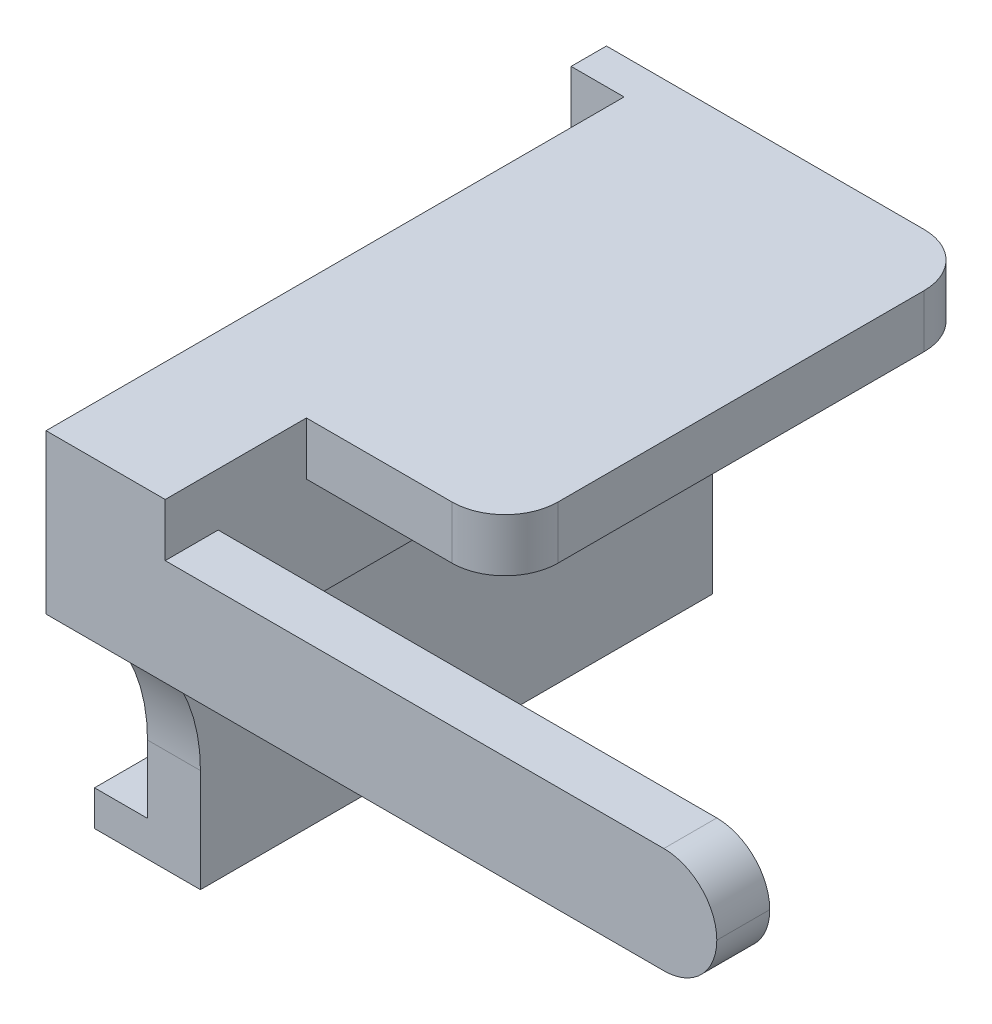
ISO-10303-21;
HEADER;
FILE_DESCRIPTION(('STEP AP214'),'2;1');
FILE_NAME('part.step','',(''),(''),'','','');
FILE_SCHEMA(('AUTOMOTIVE_DESIGN { 1 0 10303 214 1 1 1 1 }'));
ENDSEC;
DATA;
#1=APPLICATION_CONTEXT('core data for automotive mechanical design processes');
#2=APPLICATION_PROTOCOL_DEFINITION('international standard','automotive_design',2000,#1);
#3=PRODUCT_CONTEXT('',#1,'mechanical');
#4=PRODUCT('Part','Part','',(#3));
#5=PRODUCT_RELATED_PRODUCT_CATEGORY('part','',(#4));
#6=PRODUCT_DEFINITION_FORMATION('','',#4);
#7=PRODUCT_DEFINITION_CONTEXT('part definition',#1,'design');
#8=PRODUCT_DEFINITION('design','',#6,#7);
#9=PRODUCT_DEFINITION_SHAPE('','',#8);
#10=(LENGTH_UNIT() NAMED_UNIT(*) SI_UNIT(.MILLI.,.METRE.));
#11=(NAMED_UNIT(*) PLANE_ANGLE_UNIT() SI_UNIT($,.RADIAN.));
#12=(NAMED_UNIT(*) SI_UNIT($,.STERADIAN.) SOLID_ANGLE_UNIT());
#13=UNCERTAINTY_MEASURE_WITH_UNIT(LENGTH_MEASURE(1.E-05),#10,'distance_accuracy_value','');
#14=(GEOMETRIC_REPRESENTATION_CONTEXT(3) GLOBAL_UNCERTAINTY_ASSIGNED_CONTEXT((#13)) GLOBAL_UNIT_ASSIGNED_CONTEXT((#10,
#11,#12)) REPRESENTATION_CONTEXT('',''));
#15=CARTESIAN_POINT('',(0.,0.,0.));
#16=DIRECTION('',(0.,0.,1.));
#17=DIRECTION('',(1.,0.,0.));
#18=AXIS2_PLACEMENT_3D('',#15,#16,#17);
#19=CARTESIAN_POINT('',(0.,0.394799999999999,0.));
#20=DIRECTION('',(0.,-1.,0.));
#21=DIRECTION('',(0.,0.,-1.));
#22=AXIS2_PLACEMENT_3D('',#19,#20,#21);
#23=PLANE('',#22);
#24=DIRECTION('',(-1.,0.,0.));
#25=VECTOR('',#24,1.);
#26=CARTESIAN_POINT('',(0.,0.394799999999999,1.6020714590804));
#27=LINE('',#26,#25);
#28=CARTESIAN_POINT('',(6.75000001549883,0.394799999999999,1.6020714590804));
#29=VERTEX_POINT('',#28);
#30=CARTESIAN_POINT('',(3.,0.394799999999999,1.6020714590804));
#31=VERTEX_POINT('',#30);
#32=EDGE_CURVE('E13',#29,#31,#27,.T.);
#33=ORIENTED_EDGE('',*,*,#32,.F.);
#34=DIRECTION('',(0.,0.,-1.));
#35=VECTOR('',#34,1.);
#36=CARTESIAN_POINT('',(6.75000001549883,0.394800000000001,18.2210435524013));
#37=LINE('',#36,#35);
#38=CARTESIAN_POINT('',(6.75000001549883,0.394799999999996,17.2468532));
#39=VERTEX_POINT('',#38);
#40=EDGE_CURVE('E207',#39,#29,#37,.T.);
#41=ORIENTED_EDGE('',*,*,#40,.F.);
#42=DIRECTION('',(-1.,0.,0.));
#43=VECTOR('',#42,1.);
#44=CARTESIAN_POINT('',(6.75000001549883,0.394799999999996,17.2468532));
#45=LINE('',#44,#43);
#46=CARTESIAN_POINT('',(35.,0.394799999999996,17.2468532));
#47=VERTEX_POINT('',#46);
#48=EDGE_CURVE('E222',#47,#39,#45,.T.);
#49=ORIENTED_EDGE('',*,*,#48,.F.);
#50=DIRECTION('',(0.,0.,-1.));
#51=VECTOR('',#50,1.);
#52=CARTESIAN_POINT('',(35.,0.394799999999999,0.));
#53=LINE('',#52,#51);
#54=CARTESIAN_POINT('',(35.,0.394799999999996,20.2468532));
#55=VERTEX_POINT('',#54);
#56=EDGE_CURVE('E199',#47,#55,#53,.F.);
#57=ORIENTED_EDGE('',*,*,#56,.T.);
#58=DIRECTION('',(-1.,0.,0.));
#59=VECTOR('',#58,1.);
#60=CARTESIAN_POINT('',(6.75000001549883,0.394799999999996,20.2468532));
#61=LINE('',#60,#59);
#62=CARTESIAN_POINT('',(3.,0.394799999999996,20.2468532));
#63=VERTEX_POINT('',#62);
#64=EDGE_CURVE('E214',#55,#63,#61,.T.);
#65=ORIENTED_EDGE('',*,*,#64,.T.);
#66=DIRECTION('',(0.,0.,1.));
#67=VECTOR('',#66,1.);
#68=CARTESIAN_POINT('',(3.,0.394800000000001,18.2210435524013));
#69=LINE('',#68,#67);
#70=EDGE_CURVE('E216',#31,#63,#69,.T.);
#71=ORIENTED_EDGE('',*,*,#70,.F.);
#72=EDGE_LOOP('',(#33,#41,#49,#57,#65,#71));
#73=FACE_BOUND('',#72,.T.);
#74=ADVANCED_FACE('F42',(#73),#23,.T.);
#75=CARTESIAN_POINT('',(3.,0.,0.));
#76=DIRECTION('',(-1.,0.,0.));
#77=DIRECTION('',(0.,0.,1.));
#78=AXIS2_PLACEMENT_3D('',#75,#76,#77);
#79=PLANE('',#78);
#80=CARTESIAN_POINT('',(3.,0.394800000000001,-14.5));
#81=VERTEX_POINT('',#80);
#82=CARTESIAN_POINT('',(3.,0.394799999999998,-1.6020714590804));
#83=VERTEX_POINT('',#82);
#84=EDGE_CURVE('E224',#81,#83,#69,.T.);
#85=ORIENTED_EDGE('',*,*,#84,.T.);
#86=CARTESIAN_POINT('',(3.,0.,0.));
#87=DIRECTION('',(-1.,0.,0.));
#88=DIRECTION('',(0.,0.,1.));
#89=AXIS2_PLACEMENT_3D('',#86,#87,#88);
#90=CIRCLE('',#89,1.65);
#91=EDGE_CURVE('E56',#83,#31,#90,.T.);
#92=ORIENTED_EDGE('',*,*,#91,.T.);
#93=ORIENTED_EDGE('',*,*,#70,.T.);
#94=CARTESIAN_POINT('',(3.,-8.6556553641046,24.5));
#95=DIRECTION('',(-1.,0.,0.));
#96=DIRECTION('',(0.,0.,1.));
#97=AXIS2_PLACEMENT_3D('',#94,#95,#96);
#98=CIRCLE('',#97,10.);
#99=CARTESIAN_POINT('',(3.,-8.65565536410459,14.5));
#100=VERTEX_POINT('',#99);
#101=EDGE_CURVE('E292',#63,#100,#98,.T.);
#102=ORIENTED_EDGE('',*,*,#101,.T.);
#103=DIRECTION('',(0.,1.,0.));
#104=VECTOR('',#103,1.);
#105=CARTESIAN_POINT('',(3.,0.394799999999996,14.5));
#106=LINE('',#105,#104);
#107=CARTESIAN_POINT('',(3.,-14.5,14.5));
#108=VERTEX_POINT('',#107);
#109=EDGE_CURVE('E352',#108,#100,#106,.T.);
#110=ORIENTED_EDGE('',*,*,#109,.F.);
#111=DIRECTION('',(0.,0.,-1.));
#112=VECTOR('',#111,1.);
#113=CARTESIAN_POINT('',(3.,-14.5,14.5));
#114=LINE('',#113,#112);
#115=CARTESIAN_POINT('',(3.,-14.5,-14.5));
#116=VERTEX_POINT('',#115);
#117=EDGE_CURVE('E244',#108,#116,#114,.T.);
#118=ORIENTED_EDGE('',*,*,#117,.T.);
#119=DIRECTION('',(0.,1.,0.));
#120=VECTOR('',#119,1.);
#121=CARTESIAN_POINT('',(3.,-7.5,-14.5));
#122=LINE('',#121,#120);
#123=EDGE_CURVE('E246',#116,#81,#122,.T.);
#124=ORIENTED_EDGE('',*,*,#123,.T.);
#125=EDGE_LOOP('',(#85,#92,#93,#102,#110,#118,#124));
#126=FACE_BOUND('',#125,.T.);
#127=ADVANCED_FACE('F376',(#126),#79,.F.);
#128=CARTESIAN_POINT('',(0.,0.,0.));
#129=DIRECTION('',(-1.,0.,0.));
#130=DIRECTION('',(0.,0.,1.));
#131=AXIS2_PLACEMENT_3D('',#128,#129,#130);
#132=PLANE('',#131);
#133=CARTESIAN_POINT('',(0.,0.,0.));
#134=DIRECTION('',(-1.,0.,0.));
#135=DIRECTION('',(0.,0.,1.));
#136=AXIS2_PLACEMENT_3D('',#133,#134,#135);
#137=CIRCLE('',#136,1.65);
#138=CARTESIAN_POINT('',(0.,0.,1.65));
#139=VERTEX_POINT('',#138);
#140=EDGE_CURVE('E208',#139,#139,#137,.T.);
#141=ORIENTED_EDGE('',*,*,#140,.F.);
#142=EDGE_LOOP('',(#141));
#143=FACE_BOUND('',#142,.T.);
#144=DIRECTION('',(0.,-1.,0.));
#145=VECTOR('',#144,1.);
#146=CARTESIAN_POINT('',(0.,0.,14.5));
#147=LINE('',#146,#145);
#148=CARTESIAN_POINT('',(0.,-8.6556553641046,14.5));
#149=VERTEX_POINT('',#148);
#150=CARTESIAN_POINT('',(0.,-12.5,14.5));
#151=VERTEX_POINT('',#150);
#152=EDGE_CURVE('E355',#149,#151,#147,.T.);
#153=ORIENTED_EDGE('',*,*,#152,.F.);
#154=CARTESIAN_POINT('',(0.,-8.6556553641046,24.5));
#155=DIRECTION('',(-1.,0.,0.));
#156=DIRECTION('',(0.,0.,1.));
#157=AXIS2_PLACEMENT_3D('',#154,#155,#156);
#158=CIRCLE('',#157,10.);
#159=CARTESIAN_POINT('',(0.,0.394799999999996,20.2468532));
#160=VERTEX_POINT('',#159);
#161=EDGE_CURVE('E294',#149,#160,#158,.F.);
#162=ORIENTED_EDGE('',*,*,#161,.T.);
#163=DIRECTION('',(0.,-1.,0.));
#164=VECTOR('',#163,1.);
#165=CARTESIAN_POINT('',(0.,6.3948,20.2468532));
#166=LINE('',#165,#164);
#167=CARTESIAN_POINT('',(0.,9.3948,20.2468532));
#168=VERTEX_POINT('',#167);
#169=EDGE_CURVE('E359',#168,#160,#166,.T.);
#170=ORIENTED_EDGE('',*,*,#169,.F.);
#171=DIRECTION('',(0.,0.,1.));
#172=VECTOR('',#171,1.);
#173=CARTESIAN_POINT('',(0.,9.39479999999999,-12.5));
#174=LINE('',#173,#172);
#175=CARTESIAN_POINT('',(0.,9.39479999999999,-12.5));
#176=VERTEX_POINT('',#175);
#177=EDGE_CURVE('E228',#176,#168,#174,.T.);
#178=ORIENTED_EDGE('',*,*,#177,.F.);
#179=DIRECTION('',(0.,-1.,0.));
#180=VECTOR('',#179,1.);
#181=CARTESIAN_POINT('',(0.,12.5,-12.5));
#182=LINE('',#181,#180);
#183=CARTESIAN_POINT('',(0.,-11.5,-12.5));
#184=VERTEX_POINT('',#183);
#185=EDGE_CURVE('E275',#176,#184,#182,.T.);
#186=ORIENTED_EDGE('',*,*,#185,.T.);
#187=CARTESIAN_POINT('',(0.,-12.5,-12.5));
#188=DIRECTION('',(-1.,0.,0.));
#189=DIRECTION('',(0.,0.,1.));
#190=AXIS2_PLACEMENT_3D('',#187,#188,#189);
#191=CIRCLE('',#190,0.999999999999999);
#192=CARTESIAN_POINT('',(0.,-12.5,-11.5));
#193=VERTEX_POINT('',#192);
#194=EDGE_CURVE('E265',#193,#184,#191,.F.);
#195=ORIENTED_EDGE('',*,*,#194,.F.);
#196=DIRECTION('',(0.,0.,1.));
#197=VECTOR('',#196,1.);
#198=CARTESIAN_POINT('',(0.,-12.5,12.5));
#199=LINE('',#198,#197);
#200=EDGE_CURVE('E277',#193,#151,#199,.T.);
#201=ORIENTED_EDGE('',*,*,#200,.T.);
#202=EDGE_LOOP('',(#153,#162,#170,#178,#186,#195,#201));
#203=FACE_BOUND('',#202,.T.);
#204=ADVANCED_FACE('F390',(#143,#203),#132,.T.);
#205=CARTESIAN_POINT('',(6.75000001549883,0.,0.));
#206=DIRECTION('',(1.,0.,0.));
#207=DIRECTION('',(0.,0.,-1.));
#208=AXIS2_PLACEMENT_3D('',#205,#206,#207);
#209=PLANE('',#208);
#210=CARTESIAN_POINT('',(6.75000001549883,0.,0.));
#211=DIRECTION('',(1.,0.,0.));
#212=DIRECTION('',(0.,0.,-1.));
#213=AXIS2_PLACEMENT_3D('',#210,#211,#212);
#214=CIRCLE('',#213,1.65);
#215=CARTESIAN_POINT('',(6.75000001549883,0.394799999999999,-1.6020714590804));
#216=VERTEX_POINT('',#215);
#217=EDGE_CURVE('E193',#216,#29,#214,.T.);
#218=ORIENTED_EDGE('',*,*,#217,.F.);
#219=CARTESIAN_POINT('',(6.75000001549883,0.394799999999996,-14.5));
#220=VERTEX_POINT('',#219);
#221=EDGE_CURVE('E203',#216,#220,#37,.T.);
#222=ORIENTED_EDGE('',*,*,#221,.T.);
#223=DIRECTION('',(0.,1.,0.));
#224=VECTOR('',#223,1.);
#225=CARTESIAN_POINT('',(6.75000001549883,-7.5,-14.5));
#226=LINE('',#225,#224);
#227=CARTESIAN_POINT('',(6.75000001549883,6.3948,-14.5));
#228=VERTEX_POINT('',#227);
#229=EDGE_CURVE('E231',#220,#228,#226,.T.);
#230=ORIENTED_EDGE('',*,*,#229,.T.);
#231=DIRECTION('',(0.,0.,1.));
#232=VECTOR('',#231,1.);
#233=CARTESIAN_POINT('',(6.75000001549883,6.3948,-14.5));
#234=LINE('',#233,#232);
#235=CARTESIAN_POINT('',(6.75000001549883,6.39479999999999,12.2468532));
#236=VERTEX_POINT('',#235);
#237=EDGE_CURVE('E241',#228,#236,#234,.T.);
#238=ORIENTED_EDGE('',*,*,#237,.T.);
#239=DIRECTION('',(0.,-1.,0.));
#240=VECTOR('',#239,1.);
#241=CARTESIAN_POINT('',(6.75000001549883,9.39480000000001,12.2468532));
#242=LINE('',#241,#240);
#243=CARTESIAN_POINT('',(6.75000001549883,9.39480000000001,12.2468532));
#244=VERTEX_POINT('',#243);
#245=EDGE_CURVE('E339',#244,#236,#242,.T.);
#246=ORIENTED_EDGE('',*,*,#245,.F.);
#247=DIRECTION('',(0.,0.,-1.));
#248=VECTOR('',#247,1.);
#249=CARTESIAN_POINT('',(6.75000001549883,9.3948,20.2468532));
#250=LINE('',#249,#248);
#251=CARTESIAN_POINT('',(6.75000001549883,9.3948,20.2468532));
#252=VERTEX_POINT('',#251);
#253=EDGE_CURVE('E341',#252,#244,#250,.T.);
#254=ORIENTED_EDGE('',*,*,#253,.F.);
#255=DIRECTION('',(0.,1.,0.));
#256=VECTOR('',#255,1.);
#257=CARTESIAN_POINT('',(6.75000001549883,9.3948,20.2468532));
#258=LINE('',#257,#256);
#259=CARTESIAN_POINT('',(6.75000001549883,6.3948,20.2468532));
#260=VERTEX_POINT('',#259);
#261=EDGE_CURVE('E344',#260,#252,#258,.T.);
#262=ORIENTED_EDGE('',*,*,#261,.F.);
#263=DIRECTION('',(0.,0.,1.));
#264=VECTOR('',#263,1.);
#265=CARTESIAN_POINT('',(6.75000001549883,6.3948,20.2468532));
#266=LINE('',#265,#264);
#267=CARTESIAN_POINT('',(6.75000001549883,6.3948,17.2468532));
#268=VERTEX_POINT('',#267);
#269=EDGE_CURVE('E347',#268,#260,#266,.T.);
#270=ORIENTED_EDGE('',*,*,#269,.F.);
#271=DIRECTION('',(0.,1.,0.));
#272=VECTOR('',#271,1.);
#273=CARTESIAN_POINT('',(6.75000001549883,0.394799999999996,17.2468532));
#274=LINE('',#273,#272);
#275=EDGE_CURVE('E362',#39,#268,#274,.T.);
#276=ORIENTED_EDGE('',*,*,#275,.F.);
#277=ORIENTED_EDGE('',*,*,#40,.T.);
#278=EDGE_LOOP('',(#218,#222,#230,#238,#246,#254,#262,#270,#276,#277));
#279=FACE_BOUND('',#278,.T.);
#280=ADVANCED_FACE('F202',(#279),#209,.T.);
#281=DIRECTION('',(-1.,0.,0.));
#282=VECTOR('',#281,1.);
#283=CARTESIAN_POINT('',(0.,0.394799999999999,-1.6020714590804));
#284=LINE('',#283,#282);
#285=EDGE_CURVE('E50',#83,#216,#284,.F.);
#286=ORIENTED_EDGE('',*,*,#285,.F.);
#287=ORIENTED_EDGE('',*,*,#84,.F.);
#288=DIRECTION('',(-1.,0.,0.));
#289=VECTOR('',#288,1.);
#290=CARTESIAN_POINT('',(3.,0.394800000000001,-14.5));
#291=LINE('',#290,#289);
#292=EDGE_CURVE('E212',#220,#81,#291,.T.);
#293=ORIENTED_EDGE('',*,*,#292,.F.);
#294=ORIENTED_EDGE('',*,*,#221,.F.);
#295=EDGE_LOOP('',(#286,#287,#293,#294));
#296=FACE_BOUND('',#295,.T.);
#297=ADVANCED_FACE('F210',(#296),#23,.T.);
#298=CARTESIAN_POINT('',(-3.,14.5,14.5));
#299=DIRECTION('',(0.,0.,1.));
#300=DIRECTION('',(0.,-1.,0.));
#301=AXIS2_PLACEMENT_3D('',#298,#299,#300);
#302=PLANE('',#301);
#303=ORIENTED_EDGE('',*,*,#109,.T.);
#304=DIRECTION('',(-1.,0.,0.));
#305=VECTOR('',#304,1.);
#306=CARTESIAN_POINT('',(0.,-8.6556553641046,14.5));
#307=LINE('',#306,#305);
#308=EDGE_CURVE('E290',#100,#149,#307,.T.);
#309=ORIENTED_EDGE('',*,*,#308,.T.);
#310=ORIENTED_EDGE('',*,*,#152,.T.);
#311=DIRECTION('',(-1.,0.,0.));
#312=VECTOR('',#311,1.);
#313=CARTESIAN_POINT('',(5.,-12.5,14.5));
#314=LINE('',#313,#312);
#315=CARTESIAN_POINT('',(-3.,-12.5,14.5));
#316=VERTEX_POINT('',#315);
#317=EDGE_CURVE('E260',#151,#316,#314,.T.);
#318=ORIENTED_EDGE('',*,*,#317,.T.);
#319=DIRECTION('',(0.,-1.,0.));
#320=VECTOR('',#319,1.);
#321=CARTESIAN_POINT('',(-3.,14.5,14.5));
#322=LINE('',#321,#320);
#323=CARTESIAN_POINT('',(-3.,-14.5,14.5));
#324=VERTEX_POINT('',#323);
#325=EDGE_CURVE('E287',#316,#324,#322,.T.);
#326=ORIENTED_EDGE('',*,*,#325,.T.);
#327=DIRECTION('',(-1.,0.,0.));
#328=VECTOR('',#327,1.);
#329=CARTESIAN_POINT('',(10.,-14.5,14.5));
#330=LINE('',#329,#328);
#331=EDGE_CURVE('E257',#108,#324,#330,.T.);
#332=ORIENTED_EDGE('',*,*,#331,.F.);
#333=EDGE_LOOP('',(#303,#309,#310,#318,#326,#332));
#334=FACE_BOUND('',#333,.T.);
#335=ADVANCED_FACE('F384',(#334),#302,.T.);
#336=CARTESIAN_POINT('',(0.,6.3948,0.));
#337=DIRECTION('',(0.,-1.,0.));
#338=DIRECTION('',(0.,0.,-1.));
#339=AXIS2_PLACEMENT_3D('',#336,#337,#338);
#340=PLANE('',#339);
#341=DIRECTION('',(1.,0.,0.));
#342=VECTOR('',#341,1.);
#343=CARTESIAN_POINT('',(33.,6.3948,-14.5));
#344=LINE('',#343,#342);
#345=CARTESIAN_POINT('',(15.,6.3948,-14.5));
#346=VERTEX_POINT('',#345);
#347=EDGE_CURVE('E251',#228,#346,#344,.T.);
#348=ORIENTED_EDGE('',*,*,#347,.T.);
#349=CARTESIAN_POINT('',(15.,6.3948,-11.5));
#350=DIRECTION('',(0.,-1.,0.));
#351=DIRECTION('',(0.,0.,-1.));
#352=AXIS2_PLACEMENT_3D('',#349,#350,#351);
#353=CIRCLE('',#352,3.);
#354=CARTESIAN_POINT('',(18.,6.3948,-11.5));
#355=VERTEX_POINT('',#354);
#356=EDGE_CURVE('E309',#346,#355,#353,.T.);
#357=ORIENTED_EDGE('',*,*,#356,.T.);
#358=DIRECTION('',(0.,0.,-1.));
#359=VECTOR('',#358,1.);
#360=CARTESIAN_POINT('',(18.,6.3948,17.5));
#361=LINE('',#360,#359);
#362=CARTESIAN_POINT('',(18.,6.3948,9.2468532));
#363=VERTEX_POINT('',#362);
#364=EDGE_CURVE('E248',#363,#355,#361,.T.);
#365=ORIENTED_EDGE('',*,*,#364,.F.);
#366=CARTESIAN_POINT('',(15.,6.3948,9.2468532));
#367=DIRECTION('',(0.,-1.,0.));
#368=DIRECTION('',(0.,0.,-1.));
#369=AXIS2_PLACEMENT_3D('',#366,#367,#368);
#370=CIRCLE('',#369,3.);
#371=CARTESIAN_POINT('',(15.,6.39479999999999,12.2468532));
#372=VERTEX_POINT('',#371);
#373=EDGE_CURVE('E307',#363,#372,#370,.T.);
#374=ORIENTED_EDGE('',*,*,#373,.T.);
#375=DIRECTION('',(1.,0.,0.));
#376=VECTOR('',#375,1.);
#377=CARTESIAN_POINT('',(-1.79400372981871,6.39479999999999,12.2468532));
#378=LINE('',#377,#376);
#379=EDGE_CURVE('E327',#236,#372,#378,.T.);
#380=ORIENTED_EDGE('',*,*,#379,.F.);
#381=ORIENTED_EDGE('',*,*,#237,.F.);
#382=EDGE_LOOP('',(#348,#357,#365,#374,#380,#381));
#383=FACE_BOUND('',#382,.T.);
#384=ADVANCED_FACE('F443',(#383),#340,.T.);
#385=CARTESIAN_POINT('',(18.,0.,0.));
#386=DIRECTION('',(1.,0.,0.));
#387=DIRECTION('',(0.,0.,-1.));
#388=AXIS2_PLACEMENT_3D('',#385,#386,#387);
#389=PLANE('',#388);
#390=ORIENTED_EDGE('',*,*,#364,.T.);
#391=DIRECTION('',(0.,1.,0.));
#392=VECTOR('',#391,1.);
#393=CARTESIAN_POINT('',(18.,0.,-11.5));
#394=LINE('',#393,#392);
#395=CARTESIAN_POINT('',(18.,9.39479999999999,-11.5));
#396=VERTEX_POINT('',#395);
#397=EDGE_CURVE('E298',#355,#396,#394,.T.);
#398=ORIENTED_EDGE('',*,*,#397,.T.);
#399=DIRECTION('',(0.,0.,-1.));
#400=VECTOR('',#399,1.);
#401=CARTESIAN_POINT('',(18.,9.39479999999999,19.4068532));
#402=LINE('',#401,#400);
#403=CARTESIAN_POINT('',(18.,9.39479999999999,9.2468532));
#404=VERTEX_POINT('',#403);
#405=EDGE_CURVE('E227',#404,#396,#402,.T.);
#406=ORIENTED_EDGE('',*,*,#405,.F.);
#407=DIRECTION('',(0.,1.,0.));
#408=VECTOR('',#407,1.);
#409=CARTESIAN_POINT('',(18.,6.39479999999999,9.2468532));
#410=LINE('',#409,#408);
#411=EDGE_CURVE('E296',#404,#363,#410,.F.);
#412=ORIENTED_EDGE('',*,*,#411,.T.);
#413=EDGE_LOOP('',(#390,#398,#406,#412));
#414=FACE_BOUND('',#413,.T.);
#415=ADVANCED_FACE('F451',(#414),#389,.T.);
#416=CARTESIAN_POINT('',(0.,9.3948,0.));
#417=DIRECTION('',(0.,-1.,0.));
#418=DIRECTION('',(0.,0.,-1.));
#419=AXIS2_PLACEMENT_3D('',#416,#417,#418);
#420=PLANE('',#419);
#421=ORIENTED_EDGE('',*,*,#405,.T.);
#422=CARTESIAN_POINT('',(15.,9.3948,-11.5));
#423=DIRECTION('',(0.,-1.,0.));
#424=DIRECTION('',(0.,0.,-1.));
#425=AXIS2_PLACEMENT_3D('',#422,#423,#424);
#426=CIRCLE('',#425,3.);
#427=CARTESIAN_POINT('',(15.,9.39479999999999,-14.5));
#428=VERTEX_POINT('',#427);
#429=EDGE_CURVE('E303',#396,#428,#426,.F.);
#430=ORIENTED_EDGE('',*,*,#429,.T.);
#431=DIRECTION('',(-1.,0.,0.));
#432=VECTOR('',#431,1.);
#433=CARTESIAN_POINT('',(18.,9.39479999999999,-14.5));
#434=LINE('',#433,#432);
#435=CARTESIAN_POINT('',(-3.,9.39479999999999,-14.5));
#436=VERTEX_POINT('',#435);
#437=EDGE_CURVE('E236',#428,#436,#434,.T.);
#438=ORIENTED_EDGE('',*,*,#437,.T.);
#439=DIRECTION('',(0.,0.,1.));
#440=VECTOR('',#439,1.);
#441=CARTESIAN_POINT('',(-3.,9.39479999999999,-14.5));
#442=LINE('',#441,#440);
#443=CARTESIAN_POINT('',(-3.,9.39479999999999,-12.5));
#444=VERTEX_POINT('',#443);
#445=EDGE_CURVE('E234',#436,#444,#442,.T.);
#446=ORIENTED_EDGE('',*,*,#445,.T.);
#447=DIRECTION('',(1.,0.,0.));
#448=VECTOR('',#447,1.);
#449=CARTESIAN_POINT('',(-3.,9.39479999999999,-12.5));
#450=LINE('',#449,#448);
#451=EDGE_CURVE('E232',#444,#176,#450,.T.);
#452=ORIENTED_EDGE('',*,*,#451,.T.);
#453=ORIENTED_EDGE('',*,*,#177,.T.);
#454=DIRECTION('',(-1.,0.,0.));
#455=VECTOR('',#454,1.);
#456=CARTESIAN_POINT('',(28.2976466288055,9.3948,20.2468532));
#457=LINE('',#456,#455);
#458=EDGE_CURVE('E357',#252,#168,#457,.T.);
#459=ORIENTED_EDGE('',*,*,#458,.F.);
#460=ORIENTED_EDGE('',*,*,#253,.T.);
#461=DIRECTION('',(1.,0.,0.));
#462=VECTOR('',#461,1.);
#463=CARTESIAN_POINT('',(-1.79400372981871,9.39480000000001,12.2468532));
#464=LINE('',#463,#462);
#465=CARTESIAN_POINT('',(15.,9.39480000000001,12.2468532));
#466=VERTEX_POINT('',#465);
#467=EDGE_CURVE('E332',#244,#466,#464,.T.);
#468=ORIENTED_EDGE('',*,*,#467,.T.);
#469=CARTESIAN_POINT('',(15.,9.3948,9.2468532));
#470=DIRECTION('',(0.,-1.,0.));
#471=DIRECTION('',(0.,0.,-1.));
#472=AXIS2_PLACEMENT_3D('',#469,#470,#471);
#473=CIRCLE('',#472,3.);
#474=EDGE_CURVE('E301',#466,#404,#473,.F.);
#475=ORIENTED_EDGE('',*,*,#474,.T.);
#476=EDGE_LOOP('',(#421,#430,#438,#446,#452,#453,#459,#460,#468,#475));
#477=FACE_BOUND('',#476,.T.);
#478=ADVANCED_FACE('F396',(#477),#420,.F.);
#479=CARTESIAN_POINT('',(-3.,-14.5,-14.5));
#480=DIRECTION('',(0.,0.,-1.));
#481=DIRECTION('',(0.,1.,0.));
#482=AXIS2_PLACEMENT_3D('',#479,#480,#481);
#483=PLANE('',#482);
#484=ORIENTED_EDGE('',*,*,#437,.F.);
#485=DIRECTION('',(0.,1.,0.));
#486=VECTOR('',#485,1.);
#487=CARTESIAN_POINT('',(15.,-14.5,-14.5));
#488=LINE('',#487,#486);
#489=EDGE_CURVE('E305',#428,#346,#488,.F.);
#490=ORIENTED_EDGE('',*,*,#489,.T.);
#491=ORIENTED_EDGE('',*,*,#347,.F.);
#492=ORIENTED_EDGE('',*,*,#229,.F.);
#493=ORIENTED_EDGE('',*,*,#292,.T.);
#494=ORIENTED_EDGE('',*,*,#123,.F.);
#495=DIRECTION('',(-1.,0.,0.));
#496=VECTOR('',#495,1.);
#497=CARTESIAN_POINT('',(10.,-14.5,-14.5));
#498=LINE('',#497,#496);
#499=CARTESIAN_POINT('',(-3.,-14.5,-14.5));
#500=VERTEX_POINT('',#499);
#501=EDGE_CURVE('E258',#116,#500,#498,.T.);
#502=ORIENTED_EDGE('',*,*,#501,.T.);
#503=DIRECTION('',(0.,1.,0.));
#504=VECTOR('',#503,1.);
#505=CARTESIAN_POINT('',(-3.,-14.5,-14.5));
#506=LINE('',#505,#504);
#507=EDGE_CURVE('E281',#500,#436,#506,.T.);
#508=ORIENTED_EDGE('',*,*,#507,.T.);
#509=EDGE_LOOP('',(#484,#490,#491,#492,#493,#494,#502,#508));
#510=FACE_BOUND('',#509,.T.);
#511=ADVANCED_FACE('F425',(#510),#483,.T.);
#512=CARTESIAN_POINT('',(10.,-14.5,14.5));
#513=DIRECTION('',(0.,1.,0.));
#514=DIRECTION('',(0.,0.,1.));
#515=AXIS2_PLACEMENT_3D('',#512,#513,#514);
#516=PLANE('',#515);
#517=ORIENTED_EDGE('',*,*,#501,.F.);
#518=ORIENTED_EDGE('',*,*,#117,.F.);
#519=ORIENTED_EDGE('',*,*,#331,.T.);
#520=DIRECTION('',(0.,0.,-1.));
#521=VECTOR('',#520,1.);
#522=CARTESIAN_POINT('',(-3.,-14.5,14.5));
#523=LINE('',#522,#521);
#524=EDGE_CURVE('E254',#324,#500,#523,.T.);
#525=ORIENTED_EDGE('',*,*,#524,.T.);
#526=EDGE_LOOP('',(#517,#518,#519,#525));
#527=FACE_BOUND('',#526,.T.);
#528=ADVANCED_FACE('F418',(#527),#516,.F.);
#529=CARTESIAN_POINT('',(0.,-12.5,12.5));
#530=DIRECTION('',(0.,-1.,0.));
#531=DIRECTION('',(0.,0.,-1.));
#532=AXIS2_PLACEMENT_3D('',#529,#530,#531);
#533=PLANE('',#532);
#534=ORIENTED_EDGE('',*,*,#317,.F.);
#535=ORIENTED_EDGE('',*,*,#200,.F.);
#536=DIRECTION('',(-1.,0.,0.));
#537=VECTOR('',#536,1.);
#538=CARTESIAN_POINT('',(2.82842712474619,-12.5,-11.5));
#539=LINE('',#538,#537);
#540=CARTESIAN_POINT('',(-3.,-12.5,-11.5));
#541=VERTEX_POINT('',#540);
#542=EDGE_CURVE('E271',#193,#541,#539,.T.);
#543=ORIENTED_EDGE('',*,*,#542,.T.);
#544=DIRECTION('',(0.,0.,1.));
#545=VECTOR('',#544,1.);
#546=CARTESIAN_POINT('',(-3.,-12.5,12.5));
#547=LINE('',#546,#545);
#548=EDGE_CURVE('E278',#541,#316,#547,.T.);
#549=ORIENTED_EDGE('',*,*,#548,.T.);
#550=EDGE_LOOP('',(#534,#535,#543,#549));
#551=FACE_BOUND('',#550,.T.);
#552=ADVANCED_FACE('F415',(#551),#533,.F.);
#553=CARTESIAN_POINT('',(-3.,0.,0.));
#554=DIRECTION('',(1.,0.,0.));
#555=DIRECTION('',(0.,0.,-1.));
#556=AXIS2_PLACEMENT_3D('',#553,#554,#555);
#557=PLANE('',#556);
#558=DIRECTION('',(0.,-1.,0.));
#559=VECTOR('',#558,1.);
#560=CARTESIAN_POINT('',(-3.,12.5,-12.5));
#561=LINE('',#560,#559);
#562=CARTESIAN_POINT('',(-3.,-11.5,-12.5));
#563=VERTEX_POINT('',#562);
#564=EDGE_CURVE('E274',#444,#563,#561,.T.);
#565=ORIENTED_EDGE('',*,*,#564,.F.);
#566=ORIENTED_EDGE('',*,*,#445,.F.);
#567=ORIENTED_EDGE('',*,*,#507,.F.);
#568=ORIENTED_EDGE('',*,*,#524,.F.);
#569=ORIENTED_EDGE('',*,*,#325,.F.);
#570=ORIENTED_EDGE('',*,*,#548,.F.);
#571=CARTESIAN_POINT('',(-3.,-12.5,-12.5));
#572=DIRECTION('',(-1.,0.,0.));
#573=DIRECTION('',(0.,0.,1.));
#574=AXIS2_PLACEMENT_3D('',#571,#572,#573);
#575=CIRCLE('',#574,0.999999999999999);
#576=EDGE_CURVE('E263',#563,#541,#575,.T.);
#577=ORIENTED_EDGE('',*,*,#576,.F.);
#578=EDGE_LOOP('',(#565,#566,#567,#568,#569,#570,#577));
#579=FACE_BOUND('',#578,.T.);
#580=ADVANCED_FACE('F409',(#579),#557,.F.);
#581=CARTESIAN_POINT('',(0.,12.5,-12.5));
#582=DIRECTION('',(0.,0.,-1.));
#583=DIRECTION('',(0.,1.,0.));
#584=AXIS2_PLACEMENT_3D('',#581,#582,#583);
#585=PLANE('',#584);
#586=ORIENTED_EDGE('',*,*,#185,.F.);
#587=ORIENTED_EDGE('',*,*,#451,.F.);
#588=ORIENTED_EDGE('',*,*,#564,.T.);
#589=DIRECTION('',(-1.,0.,0.));
#590=VECTOR('',#589,1.);
#591=CARTESIAN_POINT('',(2.82842712474619,-11.5,-12.5));
#592=LINE('',#591,#590);
#593=EDGE_CURVE('E268',#563,#184,#592,.F.);
#594=ORIENTED_EDGE('',*,*,#593,.T.);
#595=EDGE_LOOP('',(#586,#587,#588,#594));
#596=FACE_BOUND('',#595,.T.);
#597=ADVANCED_FACE('F401',(#596),#585,.F.);
#598=CARTESIAN_POINT('',(2.82842712474619,-12.5,-12.5));
#599=DIRECTION('',(-1.,0.,0.));
#600=DIRECTION('',(0.,0.,1.));
#601=AXIS2_PLACEMENT_3D('',#598,#599,#600);
#602=CYLINDRICAL_SURFACE('',#601,0.999999999999999);
#603=ORIENTED_EDGE('',*,*,#194,.T.);
#604=ORIENTED_EDGE('',*,*,#593,.F.);
#605=ORIENTED_EDGE('',*,*,#576,.T.);
#606=ORIENTED_EDGE('',*,*,#542,.F.);
#607=EDGE_LOOP('',(#603,#604,#605,#606));
#608=FACE_BOUND('',#607,.T.);
#609=ADVANCED_FACE('F406',(#608),#602,.F.);
#610=CARTESIAN_POINT('',(6.75000001549883,6.3948,20.2468532));
#611=DIRECTION('',(0.,1.,0.));
#612=DIRECTION('',(0.,0.,1.));
#613=AXIS2_PLACEMENT_3D('',#610,#611,#612);
#614=PLANE('',#613);
#615=DIRECTION('',(1.,0.,0.));
#616=VECTOR('',#615,1.);
#617=CARTESIAN_POINT('',(6.75000001549883,6.3948,20.2468532));
#618=LINE('',#617,#616);
#619=CARTESIAN_POINT('',(35.,6.3948,20.2468532));
#620=VERTEX_POINT('',#619);
#621=EDGE_CURVE('E363',#260,#620,#618,.T.);
#622=ORIENTED_EDGE('',*,*,#621,.T.);
#623=DIRECTION('',(0.,0.,1.));
#624=VECTOR('',#623,1.);
#625=CARTESIAN_POINT('',(35.,6.3948,20.2468532));
#626=LINE('',#625,#624);
#627=CARTESIAN_POINT('',(35.,6.3948,17.2468532));
#628=VERTEX_POINT('',#627);
#629=EDGE_CURVE('E318',#620,#628,#626,.F.);
#630=ORIENTED_EDGE('',*,*,#629,.T.);
#631=DIRECTION('',(1.,0.,0.));
#632=VECTOR('',#631,1.);
#633=CARTESIAN_POINT('',(6.75000001549883,6.3948,17.2468532));
#634=LINE('',#633,#632);
#635=EDGE_CURVE('E367',#268,#628,#634,.T.);
#636=ORIENTED_EDGE('',*,*,#635,.F.);
#637=ORIENTED_EDGE('',*,*,#269,.T.);
#638=EDGE_LOOP('',(#622,#630,#636,#637));
#639=FACE_BOUND('',#638,.T.);
#640=ADVANCED_FACE('F459',(#639),#614,.T.);
#641=CARTESIAN_POINT('',(0.,0.,20.2468532));
#642=DIRECTION('',(0.,0.,-1.));
#643=DIRECTION('',(-1.,0.,0.));
#644=AXIS2_PLACEMENT_3D('',#641,#642,#643);
#645=PLANE('',#644);
#646=CARTESIAN_POINT('',(35.,3.3948,20.2468532));
#647=DIRECTION('',(0.,0.,-1.));
#648=DIRECTION('',(-1.,0.,0.));
#649=AXIS2_PLACEMENT_3D('',#646,#647,#648);
#650=CIRCLE('',#649,3.);
#651=CARTESIAN_POINT('',(38.,3.3948,20.2468532));
#652=VERTEX_POINT('',#651);
#653=EDGE_CURVE('E314',#55,#652,#650,.F.);
#654=ORIENTED_EDGE('',*,*,#653,.T.);
#655=CARTESIAN_POINT('',(35.,3.3948,20.2468532));
#656=DIRECTION('',(0.,0.,-1.));
#657=DIRECTION('',(-1.,0.,0.));
#658=AXIS2_PLACEMENT_3D('',#655,#656,#657);
#659=CIRCLE('',#658,3.);
#660=EDGE_CURVE('E316',#652,#620,#659,.F.);
#661=ORIENTED_EDGE('',*,*,#660,.T.);
#662=ORIENTED_EDGE('',*,*,#621,.F.);
#663=ORIENTED_EDGE('',*,*,#261,.T.);
#664=ORIENTED_EDGE('',*,*,#458,.T.);
#665=ORIENTED_EDGE('',*,*,#169,.T.);
#666=EDGE_CURVE('E218',#63,#160,#61,.T.);
#667=ORIENTED_EDGE('',*,*,#666,.F.);
#668=ORIENTED_EDGE('',*,*,#64,.F.);
#669=EDGE_LOOP('',(#654,#661,#662,#663,#664,#665,#667,#668));
#670=FACE_BOUND('',#669,.T.);
#671=ADVANCED_FACE('F393',(#670),#645,.F.);
#672=CARTESIAN_POINT('',(0.,0.,17.2468532));
#673=DIRECTION('',(0.,0.,-1.));
#674=DIRECTION('',(-1.,0.,0.));
#675=AXIS2_PLACEMENT_3D('',#672,#673,#674);
#676=PLANE('',#675);
#677=ORIENTED_EDGE('',*,*,#635,.T.);
#678=CARTESIAN_POINT('',(35.,3.3948,17.2468532));
#679=DIRECTION('',(0.,0.,-1.));
#680=DIRECTION('',(-1.,0.,0.));
#681=AXIS2_PLACEMENT_3D('',#678,#679,#680);
#682=CIRCLE('',#681,3.);
#683=CARTESIAN_POINT('',(38.,3.3948,17.2468532));
#684=VERTEX_POINT('',#683);
#685=EDGE_CURVE('E322',#628,#684,#682,.T.);
#686=ORIENTED_EDGE('',*,*,#685,.T.);
#687=CARTESIAN_POINT('',(35.,3.3948,17.2468532));
#688=DIRECTION('',(0.,0.,-1.));
#689=DIRECTION('',(-1.,0.,0.));
#690=AXIS2_PLACEMENT_3D('',#687,#688,#689);
#691=CIRCLE('',#690,3.);
#692=EDGE_CURVE('E64',#684,#47,#691,.T.);
#693=ORIENTED_EDGE('',*,*,#692,.T.);
#694=ORIENTED_EDGE('',*,*,#48,.T.);
#695=ORIENTED_EDGE('',*,*,#275,.T.);
#696=EDGE_LOOP('',(#677,#686,#693,#694,#695));
#697=FACE_BOUND('',#696,.T.);
#698=ADVANCED_FACE('F369',(#697),#676,.T.);
#699=CARTESIAN_POINT('',(-1.79400372981871,9.39480000000001,12.2468532));
#700=DIRECTION('',(0.,0.,-1.));
#701=DIRECTION('',(0.,1.,0.));
#702=AXIS2_PLACEMENT_3D('',#699,#700,#701);
#703=PLANE('',#702);
#704=ORIENTED_EDGE('',*,*,#379,.T.);
#705=DIRECTION('',(0.,1.,0.));
#706=VECTOR('',#705,1.);
#707=CARTESIAN_POINT('',(15.,9.39480000000001,12.2468532));
#708=LINE('',#707,#706);
#709=EDGE_CURVE('E311',#372,#466,#708,.T.);
#710=ORIENTED_EDGE('',*,*,#709,.T.);
#711=ORIENTED_EDGE('',*,*,#467,.F.);
#712=ORIENTED_EDGE('',*,*,#245,.T.);
#713=EDGE_LOOP('',(#704,#710,#711,#712));
#714=FACE_BOUND('',#713,.T.);
#715=ADVANCED_FACE('F474',(#714),#703,.F.);
#716=CARTESIAN_POINT('',(0.,-8.6556553641046,24.5));
#717=DIRECTION('',(1.,0.,0.));
#718=DIRECTION('',(0.,0.,-1.));
#719=AXIS2_PLACEMENT_3D('',#716,#717,#718);
#720=CYLINDRICAL_SURFACE('',#719,10.);
#721=ORIENTED_EDGE('',*,*,#161,.F.);
#722=ORIENTED_EDGE('',*,*,#308,.F.);
#723=ORIENTED_EDGE('',*,*,#101,.F.);
#724=ORIENTED_EDGE('',*,*,#666,.T.);
#725=EDGE_LOOP('',(#721,#722,#723,#724));
#726=FACE_BOUND('',#725,.T.);
#727=ADVANCED_FACE('F387',(#726),#720,.F.);
#728=CARTESIAN_POINT('',(15.,0.,-11.5));
#729=DIRECTION('',(0.,1.,0.));
#730=DIRECTION('',(0.,0.,1.));
#731=AXIS2_PLACEMENT_3D('',#728,#729,#730);
#732=CYLINDRICAL_SURFACE('',#731,3.);
#733=ORIENTED_EDGE('',*,*,#356,.F.);
#734=ORIENTED_EDGE('',*,*,#489,.F.);
#735=ORIENTED_EDGE('',*,*,#429,.F.);
#736=ORIENTED_EDGE('',*,*,#397,.F.);
#737=EDGE_LOOP('',(#733,#734,#735,#736));
#738=FACE_BOUND('',#737,.T.);
#739=ADVANCED_FACE('F473',(#738),#732,.T.);
#740=CARTESIAN_POINT('',(15.,9.39480000000001,9.2468532));
#741=DIRECTION('',(0.,-1.,0.));
#742=DIRECTION('',(0.,0.,-1.));
#743=AXIS2_PLACEMENT_3D('',#740,#741,#742);
#744=CYLINDRICAL_SURFACE('',#743,3.);
#745=ORIENTED_EDGE('',*,*,#373,.F.);
#746=ORIENTED_EDGE('',*,*,#411,.F.);
#747=ORIENTED_EDGE('',*,*,#474,.F.);
#748=ORIENTED_EDGE('',*,*,#709,.F.);
#749=EDGE_LOOP('',(#745,#746,#747,#748));
#750=FACE_BOUND('',#749,.T.);
#751=ADVANCED_FACE('F477',(#750),#744,.T.);
#752=CARTESIAN_POINT('',(35.,3.3948,0.));
#753=DIRECTION('',(0.,0.,-1.));
#754=DIRECTION('',(0.,1.,0.));
#755=AXIS2_PLACEMENT_3D('',#752,#753,#754);
#756=CYLINDRICAL_SURFACE('',#755,3.);
#757=ORIENTED_EDGE('',*,*,#56,.F.);
#758=ORIENTED_EDGE('',*,*,#692,.F.);
#759=DIRECTION('',(0.,0.,-1.));
#760=VECTOR('',#759,1.);
#761=CARTESIAN_POINT('',(38.,3.3948,0.));
#762=LINE('',#761,#760);
#763=EDGE_CURVE('E325',#652,#684,#762,.T.);
#764=ORIENTED_EDGE('',*,*,#763,.F.);
#765=ORIENTED_EDGE('',*,*,#653,.F.);
#766=EDGE_LOOP('',(#757,#758,#764,#765));
#767=FACE_BOUND('',#766,.T.);
#768=ADVANCED_FACE('F44',(#767),#756,.T.);
#769=CARTESIAN_POINT('',(35.,3.3948,0.));
#770=DIRECTION('',(0.,0.,1.));
#771=DIRECTION('',(1.,0.,0.));
#772=AXIS2_PLACEMENT_3D('',#769,#770,#771);
#773=CYLINDRICAL_SURFACE('',#772,3.);
#774=ORIENTED_EDGE('',*,*,#685,.F.);
#775=ORIENTED_EDGE('',*,*,#629,.F.);
#776=ORIENTED_EDGE('',*,*,#660,.F.);
#777=ORIENTED_EDGE('',*,*,#763,.T.);
#778=EDGE_LOOP('',(#774,#775,#776,#777));
#779=FACE_BOUND('',#778,.T.);
#780=ADVANCED_FACE('F481',(#779),#773,.T.);
#781=CARTESIAN_POINT('',(0.,0.,0.));
#782=DIRECTION('',(-1.,0.,0.));
#783=DIRECTION('',(0.,0.,1.));
#784=AXIS2_PLACEMENT_3D('',#781,#782,#783);
#785=CYLINDRICAL_SURFACE('',#784,1.65);
#786=ORIENTED_EDGE('',*,*,#32,.T.);
#787=ORIENTED_EDGE('',*,*,#91,.F.);
#788=ORIENTED_EDGE('',*,*,#285,.T.);
#789=ORIENTED_EDGE('',*,*,#217,.T.);
#790=EDGE_LOOP('',(#786,#787,#788,#789));
#791=FACE_BOUND('',#790,.T.);
#792=ORIENTED_EDGE('',*,*,#140,.T.);
#793=EDGE_LOOP('',(#792));
#794=FACE_BOUND('',#793,.T.);
#795=ADVANCED_FACE('F191',(#791,#794),#785,.F.);
#796=CLOSED_SHELL('',(#74,#127,#204,#280,#297,#335,#384,#415,#478,#511,#528,#552,#580,#597,#609,
#640,#671,#698,#715,#727,#739,#751,#768,#780,#795));
#797=MANIFOLD_SOLID_BREP('B2',#796);
#798=ADVANCED_BREP_SHAPE_REPRESENTATION('',(#18,#797),#14);
#799=SHAPE_DEFINITION_REPRESENTATION(#9,#798);
ENDSEC;
END-ISO-10303-21;
